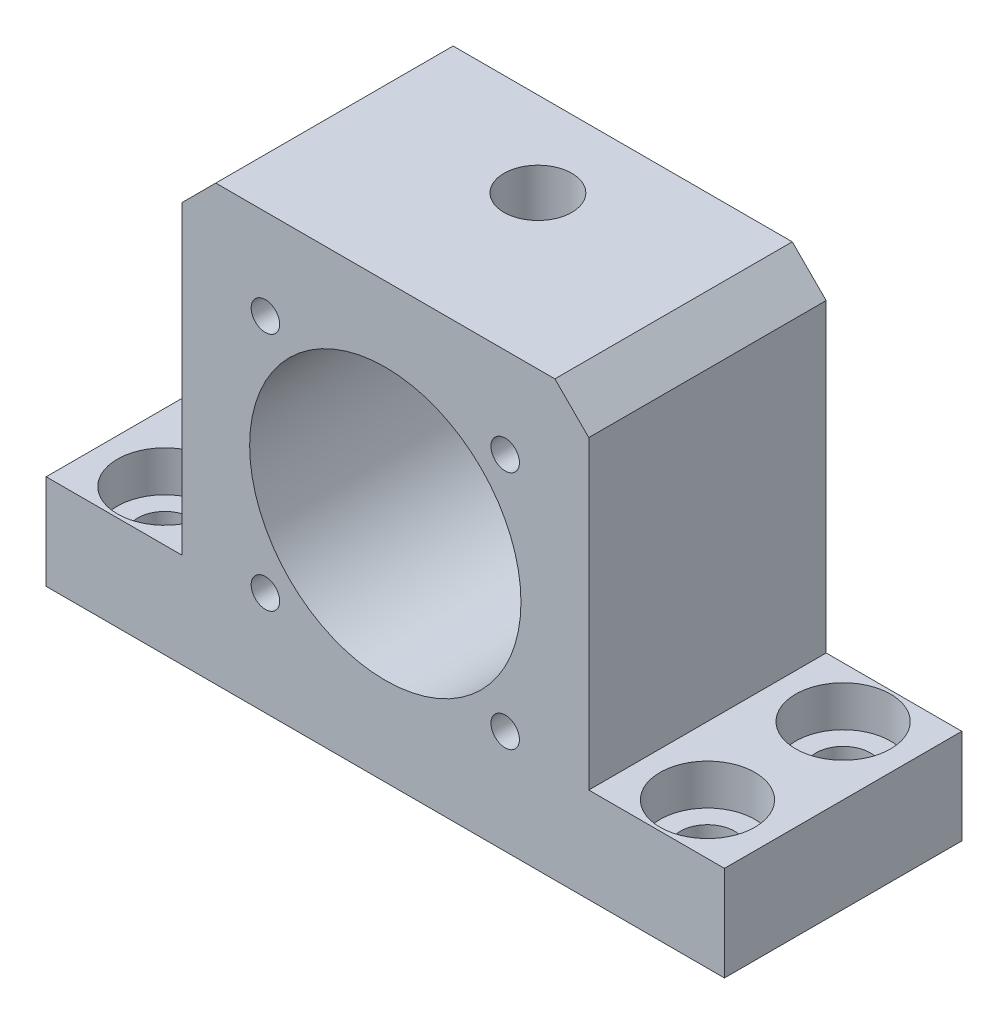
ISO-10303-21;
HEADER;
FILE_DESCRIPTION(('STEP AP214'),'2;1');
FILE_NAME('part.step','',(''),(''),'','','');
FILE_SCHEMA(('AUTOMOTIVE_DESIGN { 1 0 10303 214 1 1 1 1 }'));
ENDSEC;
DATA;
#1=APPLICATION_CONTEXT('core data for automotive mechanical design processes');
#2=APPLICATION_PROTOCOL_DEFINITION('international standard','automotive_design',2000,#1);
#3=PRODUCT_CONTEXT('',#1,'mechanical');
#4=PRODUCT('Part','Part','',(#3));
#5=PRODUCT_RELATED_PRODUCT_CATEGORY('part','',(#4));
#6=PRODUCT_DEFINITION_FORMATION('','',#4);
#7=PRODUCT_DEFINITION_CONTEXT('part definition',#1,'design');
#8=PRODUCT_DEFINITION('design','',#6,#7);
#9=PRODUCT_DEFINITION_SHAPE('','',#8);
#10=(LENGTH_UNIT() NAMED_UNIT(*) SI_UNIT(.MILLI.,.METRE.));
#11=(NAMED_UNIT(*) PLANE_ANGLE_UNIT() SI_UNIT($,.RADIAN.));
#12=(NAMED_UNIT(*) SI_UNIT($,.STERADIAN.) SOLID_ANGLE_UNIT());
#13=UNCERTAINTY_MEASURE_WITH_UNIT(LENGTH_MEASURE(1.E-05),#10,'distance_accuracy_value','');
#14=(GEOMETRIC_REPRESENTATION_CONTEXT(3) GLOBAL_UNCERTAINTY_ASSIGNED_CONTEXT((#13)) GLOBAL_UNIT_ASSIGNED_CONTEXT((#10,
#11,#12)) REPRESENTATION_CONTEXT('',''));
#15=CARTESIAN_POINT('',(0.,0.,0.));
#16=DIRECTION('',(0.,0.,1.));
#17=DIRECTION('',(1.,0.,0.));
#18=AXIS2_PLACEMENT_3D('',#15,#16,#17);
#19=CARTESIAN_POINT('',(-50.,14.,17.5));
#20=DIRECTION('',(0.,0.,-1.));
#21=DIRECTION('',(-1.,0.,0.));
#22=AXIS2_PLACEMENT_3D('',#19,#20,#21);
#23=PLANE('',#22);
#24=CARTESIAN_POINT('',(-17.6776695296636,15.3223304703362,17.5));
#25=DIRECTION('',(0.,0.,1.));
#26=DIRECTION('',(1.,0.,0.));
#27=AXIS2_PLACEMENT_3D('',#24,#25,#26);
#28=CIRCLE('',#27,2.1);
#29=CARTESIAN_POINT('',(-15.5776695296636,15.3223304703362,17.5));
#30=VERTEX_POINT('',#29);
#31=EDGE_CURVE('E289',#30,#30,#28,.T.);
#32=ORIENTED_EDGE('',*,*,#31,.F.);
#33=EDGE_LOOP('',(#32));
#34=FACE_BOUND('',#33,.T.);
#35=CARTESIAN_POINT('',(17.6776695296638,15.3223304703366,17.5));
#36=DIRECTION('',(0.,0.,1.));
#37=DIRECTION('',(1.,0.,0.));
#38=AXIS2_PLACEMENT_3D('',#35,#36,#37);
#39=CIRCLE('',#38,2.1);
#40=CARTESIAN_POINT('',(19.7776695296638,15.3223304703366,17.5));
#41=VERTEX_POINT('',#40);
#42=EDGE_CURVE('E283',#41,#41,#39,.T.);
#43=ORIENTED_EDGE('',*,*,#42,.F.);
#44=EDGE_LOOP('',(#43));
#45=FACE_BOUND('',#44,.T.);
#46=CARTESIAN_POINT('',(17.6776695296635,50.6776695296638,17.5));
#47=DIRECTION('',(0.,0.,1.));
#48=DIRECTION('',(1.,0.,0.));
#49=AXIS2_PLACEMENT_3D('',#46,#47,#48);
#50=CIRCLE('',#49,2.1);
#51=CARTESIAN_POINT('',(19.7776695296635,50.6776695296638,17.5));
#52=VERTEX_POINT('',#51);
#53=EDGE_CURVE('E277',#52,#52,#50,.T.);
#54=ORIENTED_EDGE('',*,*,#53,.F.);
#55=EDGE_LOOP('',(#54));
#56=FACE_BOUND('',#55,.T.);
#57=CARTESIAN_POINT('',(-17.6776695296639,50.6776695296636,17.5));
#58=DIRECTION('',(0.,0.,1.));
#59=DIRECTION('',(1.,0.,0.));
#60=AXIS2_PLACEMENT_3D('',#57,#58,#59);
#61=CIRCLE('',#60,2.1);
#62=CARTESIAN_POINT('',(-15.5776695296639,50.6776695296636,17.5));
#63=VERTEX_POINT('',#62);
#64=EDGE_CURVE('E271',#63,#63,#61,.T.);
#65=ORIENTED_EDGE('',*,*,#64,.F.);
#66=EDGE_LOOP('',(#65));
#67=FACE_BOUND('',#66,.T.);
#68=DIRECTION('',(0.,-1.,0.));
#69=VECTOR('',#68,1.);
#70=CARTESIAN_POINT('',(-50.,0.,17.5));
#71=LINE('',#70,#69);
#72=CARTESIAN_POINT('',(-50.,14.,17.5));
#73=VERTEX_POINT('',#72);
#74=CARTESIAN_POINT('',(-50.,0.,17.5));
#75=VERTEX_POINT('',#74);
#76=EDGE_CURVE('E167',#73,#75,#71,.T.);
#77=ORIENTED_EDGE('',*,*,#76,.T.);
#78=DIRECTION('',(1.,0.,0.));
#79=VECTOR('',#78,1.);
#80=CARTESIAN_POINT('',(-50.,0.,17.5));
#81=LINE('',#80,#79);
#82=CARTESIAN_POINT('',(50.,0.,17.5));
#83=VERTEX_POINT('',#82);
#84=EDGE_CURVE('E103',#75,#83,#81,.T.);
#85=ORIENTED_EDGE('',*,*,#84,.T.);
#86=DIRECTION('',(0.,1.,0.));
#87=VECTOR('',#86,1.);
#88=CARTESIAN_POINT('',(50.,0.,17.5));
#89=LINE('',#88,#87);
#90=CARTESIAN_POINT('',(50.,14.,17.5));
#91=VERTEX_POINT('',#90);
#92=EDGE_CURVE('E188',#83,#91,#89,.T.);
#93=ORIENTED_EDGE('',*,*,#92,.T.);
#94=DIRECTION('',(-1.,0.,0.));
#95=VECTOR('',#94,1.);
#96=CARTESIAN_POINT('',(30.,14.,17.5));
#97=LINE('',#96,#95);
#98=CARTESIAN_POINT('',(30.,14.,17.5));
#99=VERTEX_POINT('',#98);
#100=EDGE_CURVE('E207',#91,#99,#97,.T.);
#101=ORIENTED_EDGE('',*,*,#100,.T.);
#102=DIRECTION('',(0.,1.,0.));
#103=VECTOR('',#102,1.);
#104=CARTESIAN_POINT('',(30.,14.,17.5));
#105=LINE('',#104,#103);
#106=CARTESIAN_POINT('',(30.,59.,17.5));
#107=VERTEX_POINT('',#106);
#108=EDGE_CURVE('E204',#99,#107,#105,.T.);
#109=ORIENTED_EDGE('',*,*,#108,.T.);
#110=DIRECTION('',(-0.707106781186548,0.707106781186547,0.));
#111=VECTOR('',#110,1.);
#112=CARTESIAN_POINT('',(25.,64.,17.5));
#113=LINE('',#112,#111);
#114=CARTESIAN_POINT('',(25.,64.,17.5));
#115=VERTEX_POINT('',#114);
#116=EDGE_CURVE('E206',#107,#115,#113,.T.);
#117=ORIENTED_EDGE('',*,*,#116,.T.);
#118=DIRECTION('',(-1.,0.,0.));
#119=VECTOR('',#118,1.);
#120=CARTESIAN_POINT('',(-25.,64.,17.5));
#121=LINE('',#120,#119);
#122=CARTESIAN_POINT('',(-25.,64.,17.5));
#123=VERTEX_POINT('',#122);
#124=EDGE_CURVE('E130',#115,#123,#121,.T.);
#125=ORIENTED_EDGE('',*,*,#124,.T.);
#126=DIRECTION('',(-0.707106781186548,-0.707106781186547,0.));
#127=VECTOR('',#126,1.);
#128=CARTESIAN_POINT('',(-30.,59.,17.5));
#129=LINE('',#128,#127);
#130=CARTESIAN_POINT('',(-30.,59.,17.5));
#131=VERTEX_POINT('',#130);
#132=EDGE_CURVE('E124',#123,#131,#129,.T.);
#133=ORIENTED_EDGE('',*,*,#132,.T.);
#134=DIRECTION('',(0.,-1.,0.));
#135=VECTOR('',#134,1.);
#136=CARTESIAN_POINT('',(-30.,14.,17.5));
#137=LINE('',#136,#135);
#138=CARTESIAN_POINT('',(-30.,14.,17.5));
#139=VERTEX_POINT('',#138);
#140=EDGE_CURVE('E128',#131,#139,#137,.T.);
#141=ORIENTED_EDGE('',*,*,#140,.T.);
#142=DIRECTION('',(-1.,0.,0.));
#143=VECTOR('',#142,1.);
#144=CARTESIAN_POINT('',(-50.,14.,17.5));
#145=LINE('',#144,#143);
#146=EDGE_CURVE('E53',#139,#73,#145,.T.);
#147=ORIENTED_EDGE('',*,*,#146,.T.);
#148=EDGE_LOOP('',(#77,#85,#93,#101,#109,#117,#125,#133,#141,#147));
#149=FACE_BOUND('',#148,.T.);
#150=CARTESIAN_POINT('',(0.,33.,17.5));
#151=DIRECTION('',(0.,0.,1.));
#152=DIRECTION('',(1.,0.,0.));
#153=AXIS2_PLACEMENT_3D('',#150,#151,#152);
#154=CIRCLE('',#153,20.);
#155=CARTESIAN_POINT('',(20.,33.,17.5));
#156=VERTEX_POINT('',#155);
#157=EDGE_CURVE('E152',#156,#156,#154,.T.);
#158=ORIENTED_EDGE('',*,*,#157,.F.);
#159=EDGE_LOOP('',(#158));
#160=FACE_BOUND('',#159,.T.);
#161=ADVANCED_FACE('F36',(#34,#45,#56,#67,#149,#160),#23,.F.);
#162=CARTESIAN_POINT('',(-50.,14.,-17.5));
#163=DIRECTION('',(0.,0.,-1.));
#164=DIRECTION('',(-1.,0.,0.));
#165=AXIS2_PLACEMENT_3D('',#162,#163,#164);
#166=PLANE('',#165);
#167=DIRECTION('',(0.,-1.,0.));
#168=VECTOR('',#167,1.);
#169=CARTESIAN_POINT('',(-50.,0.,-17.5));
#170=LINE('',#169,#168);
#171=CARTESIAN_POINT('',(-50.,14.,-17.5));
#172=VERTEX_POINT('',#171);
#173=CARTESIAN_POINT('',(-50.,0.,-17.5));
#174=VERTEX_POINT('',#173);
#175=EDGE_CURVE('E148',#172,#174,#170,.T.);
#176=ORIENTED_EDGE('',*,*,#175,.F.);
#177=DIRECTION('',(-1.,0.,0.));
#178=VECTOR('',#177,1.);
#179=CARTESIAN_POINT('',(-50.,14.,-17.5));
#180=LINE('',#179,#178);
#181=CARTESIAN_POINT('',(-30.,14.,-17.5));
#182=VERTEX_POINT('',#181);
#183=EDGE_CURVE('E95',#182,#172,#180,.T.);
#184=ORIENTED_EDGE('',*,*,#183,.F.);
#185=DIRECTION('',(0.,-1.,0.));
#186=VECTOR('',#185,1.);
#187=CARTESIAN_POINT('',(-30.,14.,-17.5));
#188=LINE('',#187,#186);
#189=CARTESIAN_POINT('',(-30.,59.,-17.5));
#190=VERTEX_POINT('',#189);
#191=EDGE_CURVE('E89',#190,#182,#188,.T.);
#192=ORIENTED_EDGE('',*,*,#191,.F.);
#193=DIRECTION('',(-0.707106781186548,-0.707106781186547,0.));
#194=VECTOR('',#193,1.);
#195=CARTESIAN_POINT('',(-30.,59.,-17.5));
#196=LINE('',#195,#194);
#197=CARTESIAN_POINT('',(-25.,64.,-17.5));
#198=VERTEX_POINT('',#197);
#199=EDGE_CURVE('E138',#198,#190,#196,.T.);
#200=ORIENTED_EDGE('',*,*,#199,.F.);
#201=DIRECTION('',(-1.,0.,0.));
#202=VECTOR('',#201,1.);
#203=CARTESIAN_POINT('',(-25.,64.,-17.5));
#204=LINE('',#203,#202);
#205=CARTESIAN_POINT('',(25.,64.,-17.5));
#206=VERTEX_POINT('',#205);
#207=EDGE_CURVE('E162',#206,#198,#204,.T.);
#208=ORIENTED_EDGE('',*,*,#207,.F.);
#209=DIRECTION('',(-0.707106781186548,0.707106781186547,0.));
#210=VECTOR('',#209,1.);
#211=CARTESIAN_POINT('',(25.,64.,-17.5));
#212=LINE('',#211,#210);
#213=CARTESIAN_POINT('',(30.,59.,-17.5));
#214=VERTEX_POINT('',#213);
#215=EDGE_CURVE('E160',#214,#206,#212,.T.);
#216=ORIENTED_EDGE('',*,*,#215,.F.);
#217=DIRECTION('',(0.,1.,0.));
#218=VECTOR('',#217,1.);
#219=CARTESIAN_POINT('',(30.,14.,-17.5));
#220=LINE('',#219,#218);
#221=CARTESIAN_POINT('',(30.,14.,-17.5));
#222=VERTEX_POINT('',#221);
#223=EDGE_CURVE('E158',#222,#214,#220,.T.);
#224=ORIENTED_EDGE('',*,*,#223,.F.);
#225=DIRECTION('',(-1.,0.,0.));
#226=VECTOR('',#225,1.);
#227=CARTESIAN_POINT('',(30.,14.,-17.5));
#228=LINE('',#227,#226);
#229=CARTESIAN_POINT('',(50.,14.,-17.5));
#230=VERTEX_POINT('',#229);
#231=EDGE_CURVE('E156',#230,#222,#228,.T.);
#232=ORIENTED_EDGE('',*,*,#231,.F.);
#233=DIRECTION('',(0.,1.,0.));
#234=VECTOR('',#233,1.);
#235=CARTESIAN_POINT('',(50.,0.,-17.5));
#236=LINE('',#235,#234);
#237=CARTESIAN_POINT('',(50.,0.,-17.5));
#238=VERTEX_POINT('',#237);
#239=EDGE_CURVE('E154',#238,#230,#236,.T.);
#240=ORIENTED_EDGE('',*,*,#239,.F.);
#241=DIRECTION('',(1.,0.,0.));
#242=VECTOR('',#241,1.);
#243=CARTESIAN_POINT('',(-50.,0.,-17.5));
#244=LINE('',#243,#242);
#245=EDGE_CURVE('E151',#174,#238,#244,.T.);
#246=ORIENTED_EDGE('',*,*,#245,.F.);
#247=EDGE_LOOP('',(#176,#184,#192,#200,#208,#216,#224,#232,#240,#246));
#248=FACE_BOUND('',#247,.T.);
#249=CARTESIAN_POINT('',(0.,33.,-17.5));
#250=DIRECTION('',(0.,0.,1.));
#251=DIRECTION('',(1.,0.,0.));
#252=AXIS2_PLACEMENT_3D('',#249,#250,#251);
#253=CIRCLE('',#252,20.);
#254=CARTESIAN_POINT('',(20.,33.,-17.5));
#255=VERTEX_POINT('',#254);
#256=EDGE_CURVE('E215',#255,#255,#253,.T.);
#257=ORIENTED_EDGE('',*,*,#256,.T.);
#258=EDGE_LOOP('',(#257));
#259=FACE_BOUND('',#258,.T.);
#260=ADVANCED_FACE('F192',(#248,#259),#166,.T.);
#261=CARTESIAN_POINT('',(-50.,0.,17.5));
#262=DIRECTION('',(1.,0.,0.));
#263=DIRECTION('',(0.,0.,-1.));
#264=AXIS2_PLACEMENT_3D('',#261,#262,#263);
#265=PLANE('',#264);
#266=ORIENTED_EDGE('',*,*,#175,.T.);
#267=DIRECTION('',(0.,0.,-1.));
#268=VECTOR('',#267,1.);
#269=CARTESIAN_POINT('',(-50.,0.,17.5));
#270=LINE('',#269,#268);
#271=EDGE_CURVE('E11',#75,#174,#270,.T.);
#272=ORIENTED_EDGE('',*,*,#271,.F.);
#273=ORIENTED_EDGE('',*,*,#76,.F.);
#274=DIRECTION('',(0.,0.,-1.));
#275=VECTOR('',#274,1.);
#276=CARTESIAN_POINT('',(-50.,14.,17.5));
#277=LINE('',#276,#275);
#278=EDGE_CURVE('E144',#73,#172,#277,.T.);
#279=ORIENTED_EDGE('',*,*,#278,.T.);
#280=EDGE_LOOP('',(#266,#272,#273,#279));
#281=FACE_BOUND('',#280,.T.);
#282=ADVANCED_FACE('F38',(#281),#265,.F.);
#283=CARTESIAN_POINT('',(-50.,0.,17.5));
#284=DIRECTION('',(0.,1.,0.));
#285=DIRECTION('',(-1.,0.,0.));
#286=AXIS2_PLACEMENT_3D('',#283,#284,#285);
#287=PLANE('',#286);
#288=CARTESIAN_POINT('',(-40.,0.,10.));
#289=DIRECTION('',(0.,1.,0.));
#290=DIRECTION('',(0.,0.,1.));
#291=AXIS2_PLACEMENT_3D('',#288,#289,#290);
#292=CIRCLE('',#291,4.00000000000001);
#293=CARTESIAN_POINT('',(-40.,0.,14.));
#294=VERTEX_POINT('',#293);
#295=EDGE_CURVE('E256',#294,#294,#292,.T.);
#296=ORIENTED_EDGE('',*,*,#295,.T.);
#297=EDGE_LOOP('',(#296));
#298=FACE_BOUND('',#297,.T.);
#299=CARTESIAN_POINT('',(-40.,0.,-10.));
#300=DIRECTION('',(0.,1.,0.));
#301=DIRECTION('',(0.,0.,1.));
#302=AXIS2_PLACEMENT_3D('',#299,#300,#301);
#303=CIRCLE('',#302,4.00000000000001);
#304=CARTESIAN_POINT('',(-40.,0.,-5.99999999999999));
#305=VERTEX_POINT('',#304);
#306=EDGE_CURVE('E244',#305,#305,#303,.T.);
#307=ORIENTED_EDGE('',*,*,#306,.T.);
#308=EDGE_LOOP('',(#307));
#309=FACE_BOUND('',#308,.T.);
#310=CARTESIAN_POINT('',(40.,0.,-10.));
#311=DIRECTION('',(0.,1.,0.));
#312=DIRECTION('',(0.,0.,1.));
#313=AXIS2_PLACEMENT_3D('',#310,#311,#312);
#314=CIRCLE('',#313,4.00000000000001);
#315=CARTESIAN_POINT('',(40.,0.,-5.99999999999999));
#316=VERTEX_POINT('',#315);
#317=EDGE_CURVE('E232',#316,#316,#314,.T.);
#318=ORIENTED_EDGE('',*,*,#317,.T.);
#319=EDGE_LOOP('',(#318));
#320=FACE_BOUND('',#319,.T.);
#321=CARTESIAN_POINT('',(40.,0.,10.));
#322=DIRECTION('',(0.,1.,0.));
#323=DIRECTION('',(0.,0.,1.));
#324=AXIS2_PLACEMENT_3D('',#321,#322,#323);
#325=CIRCLE('',#324,4.00000000000001);
#326=CARTESIAN_POINT('',(40.,0.,14.));
#327=VERTEX_POINT('',#326);
#328=EDGE_CURVE('E218',#327,#327,#325,.T.);
#329=ORIENTED_EDGE('',*,*,#328,.T.);
#330=EDGE_LOOP('',(#329));
#331=FACE_BOUND('',#330,.T.);
#332=ORIENTED_EDGE('',*,*,#245,.T.);
#333=DIRECTION('',(0.,0.,-1.));
#334=VECTOR('',#333,1.);
#335=CARTESIAN_POINT('',(50.,0.,17.5));
#336=LINE('',#335,#334);
#337=EDGE_CURVE('E45',#83,#238,#336,.T.);
#338=ORIENTED_EDGE('',*,*,#337,.F.);
#339=ORIENTED_EDGE('',*,*,#84,.F.);
#340=ORIENTED_EDGE('',*,*,#271,.T.);
#341=EDGE_LOOP('',(#332,#338,#339,#340));
#342=FACE_BOUND('',#341,.T.);
#343=ADVANCED_FACE('F418',(#298,#309,#320,#331,#342),#287,.F.);
#344=CARTESIAN_POINT('',(50.,0.,17.5));
#345=DIRECTION('',(-1.,0.,0.));
#346=DIRECTION('',(0.,0.,1.));
#347=AXIS2_PLACEMENT_3D('',#344,#345,#346);
#348=PLANE('',#347);
#349=ORIENTED_EDGE('',*,*,#239,.T.);
#350=DIRECTION('',(0.,0.,-1.));
#351=VECTOR('',#350,1.);
#352=CARTESIAN_POINT('',(50.,14.,17.5));
#353=LINE('',#352,#351);
#354=EDGE_CURVE('E180',#91,#230,#353,.T.);
#355=ORIENTED_EDGE('',*,*,#354,.F.);
#356=ORIENTED_EDGE('',*,*,#92,.F.);
#357=ORIENTED_EDGE('',*,*,#337,.T.);
#358=EDGE_LOOP('',(#349,#355,#356,#357));
#359=FACE_BOUND('',#358,.T.);
#360=ADVANCED_FACE('F186',(#359),#348,.F.);
#361=CARTESIAN_POINT('',(30.,14.,17.5));
#362=DIRECTION('',(0.,-1.,0.));
#363=DIRECTION('',(1.,0.,0.));
#364=AXIS2_PLACEMENT_3D('',#361,#362,#363);
#365=PLANE('',#364);
#366=CARTESIAN_POINT('',(40.,14.,-10.));
#367=DIRECTION('',(0.,1.,0.));
#368=DIRECTION('',(0.,0.,1.));
#369=AXIS2_PLACEMENT_3D('',#366,#367,#368);
#370=CIRCLE('',#369,7.);
#371=CARTESIAN_POINT('',(40.,14.,-3.));
#372=VERTEX_POINT('',#371);
#373=EDGE_CURVE('E241',#372,#372,#370,.T.);
#374=ORIENTED_EDGE('',*,*,#373,.F.);
#375=EDGE_LOOP('',(#374));
#376=FACE_BOUND('',#375,.T.);
#377=CARTESIAN_POINT('',(40.,14.,10.));
#378=DIRECTION('',(0.,1.,0.));
#379=DIRECTION('',(0.,0.,1.));
#380=AXIS2_PLACEMENT_3D('',#377,#378,#379);
#381=CIRCLE('',#380,7.);
#382=CARTESIAN_POINT('',(40.,14.,17.));
#383=VERTEX_POINT('',#382);
#384=EDGE_CURVE('E229',#383,#383,#381,.T.);
#385=ORIENTED_EDGE('',*,*,#384,.F.);
#386=EDGE_LOOP('',(#385));
#387=FACE_BOUND('',#386,.T.);
#388=ORIENTED_EDGE('',*,*,#231,.T.);
#389=DIRECTION('',(0.,0.,-1.));
#390=VECTOR('',#389,1.);
#391=CARTESIAN_POINT('',(30.,14.,17.5));
#392=LINE('',#391,#390);
#393=EDGE_CURVE('E177',#99,#222,#392,.T.);
#394=ORIENTED_EDGE('',*,*,#393,.F.);
#395=ORIENTED_EDGE('',*,*,#100,.F.);
#396=ORIENTED_EDGE('',*,*,#354,.T.);
#397=EDGE_LOOP('',(#388,#394,#395,#396));
#398=FACE_BOUND('',#397,.T.);
#399=ADVANCED_FACE('F198',(#376,#387,#398),#365,.F.);
#400=CARTESIAN_POINT('',(30.,14.,17.5));
#401=DIRECTION('',(-1.,0.,0.));
#402=DIRECTION('',(0.,-1.,0.));
#403=AXIS2_PLACEMENT_3D('',#400,#401,#402);
#404=PLANE('',#403);
#405=ORIENTED_EDGE('',*,*,#223,.T.);
#406=DIRECTION('',(0.,0.,-1.));
#407=VECTOR('',#406,1.);
#408=CARTESIAN_POINT('',(30.,59.,17.5));
#409=LINE('',#408,#407);
#410=EDGE_CURVE('E174',#107,#214,#409,.T.);
#411=ORIENTED_EDGE('',*,*,#410,.F.);
#412=ORIENTED_EDGE('',*,*,#108,.F.);
#413=ORIENTED_EDGE('',*,*,#393,.T.);
#414=EDGE_LOOP('',(#405,#411,#412,#413));
#415=FACE_BOUND('',#414,.T.);
#416=ADVANCED_FACE('F202',(#415),#404,.F.);
#417=CARTESIAN_POINT('',(25.,64.,17.5));
#418=DIRECTION('',(-0.707106781186547,-0.707106781186548,0.));
#419=DIRECTION('',(0.707106781186548,-0.707106781186547,0.));
#420=AXIS2_PLACEMENT_3D('',#417,#418,#419);
#421=PLANE('',#420);
#422=ORIENTED_EDGE('',*,*,#215,.T.);
#423=DIRECTION('',(0.,0.,-1.));
#424=VECTOR('',#423,1.);
#425=CARTESIAN_POINT('',(25.,64.,17.5));
#426=LINE('',#425,#424);
#427=EDGE_CURVE('E171',#115,#206,#426,.T.);
#428=ORIENTED_EDGE('',*,*,#427,.F.);
#429=ORIENTED_EDGE('',*,*,#116,.F.);
#430=ORIENTED_EDGE('',*,*,#410,.T.);
#431=EDGE_LOOP('',(#422,#428,#429,#430));
#432=FACE_BOUND('',#431,.T.);
#433=ADVANCED_FACE('F407',(#432),#421,.F.);
#434=CARTESIAN_POINT('',(-25.,64.,17.5));
#435=DIRECTION('',(0.,-1.,0.));
#436=DIRECTION('',(0.,0.,-1.));
#437=AXIS2_PLACEMENT_3D('',#434,#435,#436);
#438=PLANE('',#437);
#439=CARTESIAN_POINT('',(0.,64.,-5.));
#440=DIRECTION('',(0.,1.,0.));
#441=DIRECTION('',(0.,0.,1.));
#442=AXIS2_PLACEMENT_3D('',#439,#440,#441);
#443=CIRCLE('',#442,5.);
#444=CARTESIAN_POINT('',(0.,64.,0.));
#445=VERTEX_POINT('',#444);
#446=EDGE_CURVE('E292',#445,#445,#443,.T.);
#447=ORIENTED_EDGE('',*,*,#446,.F.);
#448=EDGE_LOOP('',(#447));
#449=FACE_BOUND('',#448,.T.);
#450=ORIENTED_EDGE('',*,*,#207,.T.);
#451=DIRECTION('',(0.,0.,-1.));
#452=VECTOR('',#451,1.);
#453=CARTESIAN_POINT('',(-25.,64.,17.5));
#454=LINE('',#453,#452);
#455=EDGE_CURVE('E139',#123,#198,#454,.T.);
#456=ORIENTED_EDGE('',*,*,#455,.F.);
#457=ORIENTED_EDGE('',*,*,#124,.F.);
#458=ORIENTED_EDGE('',*,*,#427,.T.);
#459=EDGE_LOOP('',(#450,#456,#457,#458));
#460=FACE_BOUND('',#459,.T.);
#461=ADVANCED_FACE('F404',(#449,#460),#438,.F.);
#462=CARTESIAN_POINT('',(-30.,59.,17.5));
#463=DIRECTION('',(0.707106781186547,-0.707106781186548,0.));
#464=DIRECTION('',(0.707106781186548,0.707106781186547,0.));
#465=AXIS2_PLACEMENT_3D('',#462,#463,#464);
#466=PLANE('',#465);
#467=ORIENTED_EDGE('',*,*,#199,.T.);
#468=DIRECTION('',(0.,0.,-1.));
#469=VECTOR('',#468,1.);
#470=CARTESIAN_POINT('',(-30.,59.,17.5));
#471=LINE('',#470,#469);
#472=EDGE_CURVE('E135',#131,#190,#471,.T.);
#473=ORIENTED_EDGE('',*,*,#472,.F.);
#474=ORIENTED_EDGE('',*,*,#132,.F.);
#475=ORIENTED_EDGE('',*,*,#455,.T.);
#476=EDGE_LOOP('',(#467,#473,#474,#475));
#477=FACE_BOUND('',#476,.T.);
#478=ADVANCED_FACE('F136',(#477),#466,.F.);
#479=CARTESIAN_POINT('',(-30.,14.,17.5));
#480=DIRECTION('',(1.,0.,0.));
#481=DIRECTION('',(0.,0.,-1.));
#482=AXIS2_PLACEMENT_3D('',#479,#480,#481);
#483=PLANE('',#482);
#484=ORIENTED_EDGE('',*,*,#191,.T.);
#485=DIRECTION('',(0.,0.,-1.));
#486=VECTOR('',#485,1.);
#487=CARTESIAN_POINT('',(-30.,14.,17.5));
#488=LINE('',#487,#486);
#489=EDGE_CURVE('E140',#139,#182,#488,.T.);
#490=ORIENTED_EDGE('',*,*,#489,.F.);
#491=ORIENTED_EDGE('',*,*,#140,.F.);
#492=ORIENTED_EDGE('',*,*,#472,.T.);
#493=EDGE_LOOP('',(#484,#490,#491,#492));
#494=FACE_BOUND('',#493,.T.);
#495=ADVANCED_FACE('F142',(#494),#483,.F.);
#496=CARTESIAN_POINT('',(-50.,14.,17.5));
#497=DIRECTION('',(0.,-1.,0.));
#498=DIRECTION('',(0.,0.,-1.));
#499=AXIS2_PLACEMENT_3D('',#496,#497,#498);
#500=PLANE('',#499);
#501=CARTESIAN_POINT('',(-40.,14.,10.));
#502=DIRECTION('',(0.,1.,0.));
#503=DIRECTION('',(0.,0.,1.));
#504=AXIS2_PLACEMENT_3D('',#501,#502,#503);
#505=CIRCLE('',#504,7.);
#506=CARTESIAN_POINT('',(-40.,14.,17.));
#507=VERTEX_POINT('',#506);
#508=EDGE_CURVE('E265',#507,#507,#505,.T.);
#509=ORIENTED_EDGE('',*,*,#508,.F.);
#510=EDGE_LOOP('',(#509));
#511=FACE_BOUND('',#510,.T.);
#512=CARTESIAN_POINT('',(-40.,14.,-10.));
#513=DIRECTION('',(0.,1.,0.));
#514=DIRECTION('',(0.,0.,1.));
#515=AXIS2_PLACEMENT_3D('',#512,#513,#514);
#516=CIRCLE('',#515,7.);
#517=CARTESIAN_POINT('',(-40.,14.,-3.));
#518=VERTEX_POINT('',#517);
#519=EDGE_CURVE('E253',#518,#518,#516,.T.);
#520=ORIENTED_EDGE('',*,*,#519,.F.);
#521=EDGE_LOOP('',(#520));
#522=FACE_BOUND('',#521,.T.);
#523=ORIENTED_EDGE('',*,*,#183,.T.);
#524=ORIENTED_EDGE('',*,*,#278,.F.);
#525=ORIENTED_EDGE('',*,*,#146,.F.);
#526=ORIENTED_EDGE('',*,*,#489,.T.);
#527=EDGE_LOOP('',(#523,#524,#525,#526));
#528=FACE_BOUND('',#527,.T.);
#529=ADVANCED_FACE('F390',(#511,#522,#528),#500,.F.);
#530=CARTESIAN_POINT('',(0.,33.,17.5));
#531=DIRECTION('',(0.,0.,-1.));
#532=DIRECTION('',(-1.,0.,0.));
#533=AXIS2_PLACEMENT_3D('',#530,#531,#532);
#534=CYLINDRICAL_SURFACE('',#533,20.);
#535=CARTESIAN_POINT('',(0.,53.,0.));
#536=CARTESIAN_POINT('',(0.276253628899103,52.9999953289338,-7.75246052686772E-06));
#537=CARTESIAN_POINT('',(0.552593859435877,52.9942192710609,-0.0229718359126231));
#538=CARTESIAN_POINT('',(1.09735441256844,52.9717371276631,-0.114083837690015));
#539=CARTESIAN_POINT('',(1.3657701562358,52.9550248473325,-0.182257365126166));
#540=CARTESIAN_POINT('',(1.88673624060859,52.9125208777344,-0.36146417820695));
#541=CARTESIAN_POINT('',(2.13930521143334,52.8867400947353,-0.472445995717562));
#542=CARTESIAN_POINT('',(2.62224043968143,52.8288447935874,-0.733937966816138));
#543=CARTESIAN_POINT('',(2.85260594782921,52.7967300618052,-0.884449453729889));
#544=CARTESIAN_POINT('',(3.28933975766972,52.7289137863898,-1.2240026321806));
#545=CARTESIAN_POINT('',(3.49518563353686,52.6931569049376,-1.41370524986353));
#546=CARTESIAN_POINT('',(3.87249642401107,52.6224540039312,-1.82484068303011));
#547=CARTESIAN_POINT('',(4.04395745649731,52.5875080763289,-2.04627707648979));
#548=CARTESIAN_POINT('',(4.35008847599658,52.5218258566056,-2.51865075578997));
#549=CARTESIAN_POINT('',(4.4841740530838,52.4911598154937,-2.76997743602909));
#550=CARTESIAN_POINT('',(4.70798969516915,52.4383164939339,-3.29249470553345));
#551=CARTESIAN_POINT('',(4.79772685146714,52.4161378564806,-3.56368211110672));
#552=CARTESIAN_POINT('',(4.92851612268255,52.3833492232108,-4.11247832733886));
#553=CARTESIAN_POINT('',(4.97050756110685,52.372516366567,-4.38984965345997));
#554=CARTESIAN_POINT('',(5.00753925022136,52.3629787486531,-4.94789522999782));
#555=CARTESIAN_POINT('',(5.00258713939371,52.3642720142643,-5.22856893564046));
#556=CARTESIAN_POINT('',(4.94662174879902,52.3786401838939,-5.77805269248451));
#557=CARTESIAN_POINT('',(4.89672780063545,52.3914287669098,-6.04698540488443));
#558=CARTESIAN_POINT('',(4.75408062300998,52.426890322369,-6.5725368363702));
#559=CARTESIAN_POINT('',(4.66132434023131,52.4495639989746,-6.82915467676307));
#560=CARTESIAN_POINT('',(4.43463159312395,52.5025037968553,-7.3257933875071));
#561=CARTESIAN_POINT('',(4.3002888907764,52.5328442489939,-7.5656205726319));
#562=CARTESIAN_POINT('',(3.99452092004982,52.5976570281997,-8.01972903252274));
#563=CARTESIAN_POINT('',(3.82308916269613,52.6321300778209,-8.23400582689084));
#564=CARTESIAN_POINT('',(3.44221141560407,52.7025293513297,-8.63734538564802));
#565=CARTESIAN_POINT('',(3.23182086055287,52.7384689826,-8.82551496687117));
#566=CARTESIAN_POINT('',(2.78203972501233,52.8068655192919,-9.16407080821301));
#567=CARTESIAN_POINT('',(2.54264825902648,52.8393223183136,-9.31445591421189));
#568=CARTESIAN_POINT('',(2.04038629560464,52.897257736473,-9.57350195408129));
#569=CARTESIAN_POINT('',(1.77743797736208,52.9227120042576,-9.6820178008481));
#570=CARTESIAN_POINT('',(1.23625336047628,52.9635972330472,-9.85305768569858));
#571=CARTESIAN_POINT('',(0.958019997168282,52.9790301113094,-9.91559052139379));
#572=CARTESIAN_POINT('',(0.401799901300089,52.9978499757125,-9.99152521852946));
#573=CARTESIAN_POINT('',(0.123989066627366,53.0015351169426,-10.006143420251));
#574=CARTESIAN_POINT('',(-0.430109582671696,52.9972934938151,-9.98916999314838));
#575=CARTESIAN_POINT('',(-0.706397532148654,52.9893677747284,-9.95758252400288));
#576=CARTESIAN_POINT('',(-1.24538089592163,52.9629860375784,-9.85009697202875));
#577=CARTESIAN_POINT('',(-1.50821706322917,52.9446878061929,-9.77486245507676));
#578=CARTESIAN_POINT('',(-2.01752430817505,52.899623554472,-9.5829763865718));
#579=CARTESIAN_POINT('',(-2.26399373010884,52.8728566789995,-9.46632065228927));
#580=CARTESIAN_POINT('',(-2.73841044809943,52.8131102642072,-9.19254623708441));
#581=CARTESIAN_POINT('',(-2.96595147278588,52.7800289122194,-9.03474629201144));
#582=CARTESIAN_POINT('',(-3.39175537881104,52.7114836395924,-8.68403363734279));
#583=CARTESIAN_POINT('',(-3.59001319657751,52.676019308434,-8.49111486794122));
#584=CARTESIAN_POINT('',(-3.95663522690827,52.6056318986475,-8.06999346385427));
#585=CARTESIAN_POINT('',(-4.12414622540362,52.57074347274,-7.84104099000128));
#586=CARTESIAN_POINT('',(-4.41836919671215,52.5064292794107,-7.35755788510492));
#587=CARTESIAN_POINT('',(-4.54508298053823,52.4770032695336,-7.10302839009921));
#588=CARTESIAN_POINT('',(-4.75317140202426,52.4272698238587,-6.57698092531186));
#589=CARTESIAN_POINT('',(-4.83481465547784,52.4069085073876,-6.30557457228981));
#590=CARTESIAN_POINT('',(-4.95115219981057,52.3775581342603,-5.75230120715155));
#591=CARTESIAN_POINT('',(-4.98585675825596,52.3685665905607,-5.47043649660462));
#592=CARTESIAN_POINT('',(-5.00679530111928,52.3631633735661,-4.91292992044032));
#593=CARTESIAN_POINT('',(-4.99439299259115,52.366397756045,-4.63734188285435));
#594=CARTESIAN_POINT('',(-4.92459092769654,52.3842636317314,-4.09232037106101));
#595=CARTESIAN_POINT('',(-4.86719207562106,52.3988948958968,-3.82288677328047));
#596=CARTESIAN_POINT('',(-4.70977106481402,52.4377086899188,-3.29930513646664));
#597=CARTESIAN_POINT('',(-4.61000468226918,52.461833841343,-3.04507564920413));
#598=CARTESIAN_POINT('',(-4.37088304534897,52.5169251906949,-2.5567820576162));
#599=CARTESIAN_POINT('',(-4.23152230011362,52.5478923373231,-2.3227207560423));
#600=CARTESIAN_POINT('',(-3.91289249545747,52.6141878088207,-1.87481790332794));
#601=CARTESIAN_POINT('',(-3.73267720970761,52.6496088277351,-1.66166308858716));
#602=CARTESIAN_POINT('',(-3.33929790396569,52.7202675748663,-1.26817651734828));
#603=CARTESIAN_POINT('',(-3.12612607087046,52.755505257566,-1.08785256629));
#604=CARTESIAN_POINT('',(-2.66822528900866,52.8225885215915,-0.761962304784741));
#605=CARTESIAN_POINT('',(-2.42299474105463,52.8543611121963,-0.617084621094761));
#606=CARTESIAN_POINT('',(-1.91088686503491,52.9101641658366,-0.370841790198204));
#607=CARTESIAN_POINT('',(-1.6440252114558,52.9342001733259,-0.269445464504871));
#608=CARTESIAN_POINT('',(-1.14803417747824,52.9682686521849,-0.128093898901159));
#609=CARTESIAN_POINT('',(-0.921267236360229,52.9800861684231,-0.0801625231552213));
#610=CARTESIAN_POINT('',(-0.463020238454277,52.9959535077316,-0.0161135212601914));
#611=CARTESIAN_POINT('',(-0.231540537475388,53.0000039150298,6.4976843403733E-06));
#612=CARTESIAN_POINT('',(0.,53.,0.));
#613=B_SPLINE_CURVE_WITH_KNOTS('',3,(#535,#536,#537,#538,#539,#540,#541,#542,#543,#544,#545,
#546,#547,#548,#549,#550,#551,#552,#553,#554,#555,#556,#557,#558,#559,#560,#561,#562,#563,#564,
#565,#566,#567,#568,#569,#570,#571,#572,#573,#574,#575,#576,#577,#578,#579,#580,#581,#582,#583,
#584,#585,#586,#587,#588,#589,#590,#591,#592,#593,#594,#595,#596,#597,#598,#599,#600,#601,#602,
#603,#604,#605,#606,#607,#608,#609,#610,#611,#612),.UNSPECIFIED.,.T.,.F.,(4,2,2,2,2,2,2,2,2,2,2,
2,2,2,2,2,2,2,2,2,2,2,2,2,2,2,2,2,2,2,2,2,2,2,2,2,2,2,4),(0.,0.827912374906299,1.65629412587967,
2.48368300762035,3.31109980056443,4.1538145145713,4.9966243193354,5.85195491819356,
6.70714870564561,7.54520983670233,8.38313460386725,9.20074990034463,10.0184234489786,
10.84435092924,11.6704230279828,12.5200500324113,13.3697029853856,14.2222743004145,
15.0746824563988,15.9052769650866,16.7357967038688,17.5540091505786,18.372304244187,
19.2051195856224,20.0380787670447,20.8914836402599,21.7448506250943,22.5930751539527,
23.4411141086095,24.2647926801851,25.0884546987996,25.9072133522467,26.7260856048285,
27.5663192139288,28.4067523259457,29.2624061835847,30.1174454609768,30.8114080983367,
31.5053185350331),.UNSPECIFIED.);
#614=CARTESIAN_POINT('',(0.,53.,0.));
#615=VERTEX_POINT('',#614);
#616=EDGE_CURVE('E293',#615,#615,#613,.T.);
#617=ORIENTED_EDGE('',*,*,#616,.T.);
#618=EDGE_LOOP('',(#617));
#619=FACE_BOUND('',#618,.T.);
#620=ORIENTED_EDGE('',*,*,#157,.T.);
#621=EDGE_LOOP('',(#620));
#622=FACE_BOUND('',#621,.T.);
#623=ORIENTED_EDGE('',*,*,#256,.F.);
#624=EDGE_LOOP('',(#623));
#625=FACE_BOUND('',#624,.T.);
#626=ADVANCED_FACE('F386',(#619,#622,#625),#534,.F.);
#627=CARTESIAN_POINT('',(40.,14.,10.));
#628=DIRECTION('',(0.,1.,0.));
#629=DIRECTION('',(0.,0.,1.));
#630=AXIS2_PLACEMENT_3D('',#627,#628,#629);
#631=CYLINDRICAL_SURFACE('',#630,4.);
#632=ORIENTED_EDGE('',*,*,#328,.F.);
#633=EDGE_LOOP('',(#632));
#634=FACE_BOUND('',#633,.T.);
#635=CARTESIAN_POINT('',(40.,8.00000000000001,10.));
#636=DIRECTION('',(0.,1.,0.));
#637=DIRECTION('',(0.,0.,1.));
#638=AXIS2_PLACEMENT_3D('',#635,#636,#637);
#639=CIRCLE('',#638,4.);
#640=CARTESIAN_POINT('',(40.,8.00000000000001,14.));
#641=VERTEX_POINT('',#640);
#642=EDGE_CURVE('E223',#641,#641,#639,.T.);
#643=ORIENTED_EDGE('',*,*,#642,.T.);
#644=EDGE_LOOP('',(#643));
#645=FACE_BOUND('',#644,.T.);
#646=ADVANCED_FACE('F382',(#634,#645),#631,.F.);
#647=CARTESIAN_POINT('',(44.,8.00000000000001,10.));
#648=DIRECTION('',(0.,-1.,0.));
#649=DIRECTION('',(0.,0.,-1.));
#650=AXIS2_PLACEMENT_3D('',#647,#648,#649);
#651=PLANE('',#650);
#652=ORIENTED_EDGE('',*,*,#642,.F.);
#653=EDGE_LOOP('',(#652));
#654=FACE_BOUND('',#653,.T.);
#655=CARTESIAN_POINT('',(40.,8.00000000000001,10.));
#656=DIRECTION('',(0.,1.,0.));
#657=DIRECTION('',(0.,0.,1.));
#658=AXIS2_PLACEMENT_3D('',#655,#656,#657);
#659=CIRCLE('',#658,7.);
#660=CARTESIAN_POINT('',(40.,8.00000000000001,17.));
#661=VERTEX_POINT('',#660);
#662=EDGE_CURVE('E226',#661,#661,#659,.T.);
#663=ORIENTED_EDGE('',*,*,#662,.T.);
#664=EDGE_LOOP('',(#663));
#665=FACE_BOUND('',#664,.T.);
#666=ADVANCED_FACE('F378',(#654,#665),#651,.F.);
#667=CARTESIAN_POINT('',(40.,14.,10.));
#668=DIRECTION('',(0.,1.,0.));
#669=DIRECTION('',(0.,0.,1.));
#670=AXIS2_PLACEMENT_3D('',#667,#668,#669);
#671=CYLINDRICAL_SURFACE('',#670,7.);
#672=ORIENTED_EDGE('',*,*,#662,.F.);
#673=EDGE_LOOP('',(#672));
#674=FACE_BOUND('',#673,.T.);
#675=ORIENTED_EDGE('',*,*,#384,.T.);
#676=EDGE_LOOP('',(#675));
#677=FACE_BOUND('',#676,.T.);
#678=ADVANCED_FACE('F374',(#674,#677),#671,.F.);
#679=CARTESIAN_POINT('',(40.,14.,-10.));
#680=DIRECTION('',(0.,1.,0.));
#681=DIRECTION('',(0.,0.,1.));
#682=AXIS2_PLACEMENT_3D('',#679,#680,#681);
#683=CYLINDRICAL_SURFACE('',#682,4.);
#684=ORIENTED_EDGE('',*,*,#317,.F.);
#685=EDGE_LOOP('',(#684));
#686=FACE_BOUND('',#685,.T.);
#687=CARTESIAN_POINT('',(40.,8.00000000000001,-10.));
#688=DIRECTION('',(0.,1.,0.));
#689=DIRECTION('',(0.,0.,1.));
#690=AXIS2_PLACEMENT_3D('',#687,#688,#689);
#691=CIRCLE('',#690,4.);
#692=CARTESIAN_POINT('',(40.,8.00000000000001,-6.));
#693=VERTEX_POINT('',#692);
#694=EDGE_CURVE('E235',#693,#693,#691,.T.);
#695=ORIENTED_EDGE('',*,*,#694,.T.);
#696=EDGE_LOOP('',(#695));
#697=FACE_BOUND('',#696,.T.);
#698=ADVANCED_FACE('F370',(#686,#697),#683,.F.);
#699=CARTESIAN_POINT('',(44.,8.00000000000001,-10.));
#700=DIRECTION('',(0.,-1.,0.));
#701=DIRECTION('',(0.,0.,-1.));
#702=AXIS2_PLACEMENT_3D('',#699,#700,#701);
#703=PLANE('',#702);
#704=ORIENTED_EDGE('',*,*,#694,.F.);
#705=EDGE_LOOP('',(#704));
#706=FACE_BOUND('',#705,.T.);
#707=CARTESIAN_POINT('',(40.,8.00000000000001,-10.));
#708=DIRECTION('',(0.,1.,0.));
#709=DIRECTION('',(0.,0.,1.));
#710=AXIS2_PLACEMENT_3D('',#707,#708,#709);
#711=CIRCLE('',#710,7.);
#712=CARTESIAN_POINT('',(40.,8.00000000000001,-3.));
#713=VERTEX_POINT('',#712);
#714=EDGE_CURVE('E238',#713,#713,#711,.T.);
#715=ORIENTED_EDGE('',*,*,#714,.T.);
#716=EDGE_LOOP('',(#715));
#717=FACE_BOUND('',#716,.T.);
#718=ADVANCED_FACE('F366',(#706,#717),#703,.F.);
#719=CARTESIAN_POINT('',(40.,14.,-10.));
#720=DIRECTION('',(0.,1.,0.));
#721=DIRECTION('',(0.,0.,1.));
#722=AXIS2_PLACEMENT_3D('',#719,#720,#721);
#723=CYLINDRICAL_SURFACE('',#722,7.);
#724=ORIENTED_EDGE('',*,*,#714,.F.);
#725=EDGE_LOOP('',(#724));
#726=FACE_BOUND('',#725,.T.);
#727=ORIENTED_EDGE('',*,*,#373,.T.);
#728=EDGE_LOOP('',(#727));
#729=FACE_BOUND('',#728,.T.);
#730=ADVANCED_FACE('F362',(#726,#729),#723,.F.);
#731=CARTESIAN_POINT('',(-40.,14.,-10.));
#732=DIRECTION('',(0.,1.,0.));
#733=DIRECTION('',(0.,0.,1.));
#734=AXIS2_PLACEMENT_3D('',#731,#732,#733);
#735=CYLINDRICAL_SURFACE('',#734,4.);
#736=ORIENTED_EDGE('',*,*,#306,.F.);
#737=EDGE_LOOP('',(#736));
#738=FACE_BOUND('',#737,.T.);
#739=CARTESIAN_POINT('',(-40.,8.,-10.));
#740=DIRECTION('',(0.,1.,0.));
#741=DIRECTION('',(0.,0.,1.));
#742=AXIS2_PLACEMENT_3D('',#739,#740,#741);
#743=CIRCLE('',#742,4.);
#744=CARTESIAN_POINT('',(-40.,8.,-6.));
#745=VERTEX_POINT('',#744);
#746=EDGE_CURVE('E247',#745,#745,#743,.T.);
#747=ORIENTED_EDGE('',*,*,#746,.T.);
#748=EDGE_LOOP('',(#747));
#749=FACE_BOUND('',#748,.T.);
#750=ADVANCED_FACE('F358',(#738,#749),#735,.F.);
#751=CARTESIAN_POINT('',(-36.,8.,-10.));
#752=DIRECTION('',(0.,-1.,0.));
#753=DIRECTION('',(0.,0.,-1.));
#754=AXIS2_PLACEMENT_3D('',#751,#752,#753);
#755=PLANE('',#754);
#756=ORIENTED_EDGE('',*,*,#746,.F.);
#757=EDGE_LOOP('',(#756));
#758=FACE_BOUND('',#757,.T.);
#759=CARTESIAN_POINT('',(-40.,8.,-10.));
#760=DIRECTION('',(0.,1.,0.));
#761=DIRECTION('',(0.,0.,1.));
#762=AXIS2_PLACEMENT_3D('',#759,#760,#761);
#763=CIRCLE('',#762,7.);
#764=CARTESIAN_POINT('',(-40.,8.,-3.));
#765=VERTEX_POINT('',#764);
#766=EDGE_CURVE('E250',#765,#765,#763,.T.);
#767=ORIENTED_EDGE('',*,*,#766,.T.);
#768=EDGE_LOOP('',(#767));
#769=FACE_BOUND('',#768,.T.);
#770=ADVANCED_FACE('F354',(#758,#769),#755,.F.);
#771=CARTESIAN_POINT('',(-40.,14.,-10.));
#772=DIRECTION('',(0.,1.,0.));
#773=DIRECTION('',(0.,0.,1.));
#774=AXIS2_PLACEMENT_3D('',#771,#772,#773);
#775=CYLINDRICAL_SURFACE('',#774,7.);
#776=ORIENTED_EDGE('',*,*,#766,.F.);
#777=EDGE_LOOP('',(#776));
#778=FACE_BOUND('',#777,.T.);
#779=ORIENTED_EDGE('',*,*,#519,.T.);
#780=EDGE_LOOP('',(#779));
#781=FACE_BOUND('',#780,.T.);
#782=ADVANCED_FACE('F350',(#778,#781),#775,.F.);
#783=CARTESIAN_POINT('',(-40.,14.,10.));
#784=DIRECTION('',(0.,1.,0.));
#785=DIRECTION('',(0.,0.,1.));
#786=AXIS2_PLACEMENT_3D('',#783,#784,#785);
#787=CYLINDRICAL_SURFACE('',#786,4.);
#788=ORIENTED_EDGE('',*,*,#295,.F.);
#789=EDGE_LOOP('',(#788));
#790=FACE_BOUND('',#789,.T.);
#791=CARTESIAN_POINT('',(-40.,8.,10.));
#792=DIRECTION('',(0.,1.,0.));
#793=DIRECTION('',(0.,0.,1.));
#794=AXIS2_PLACEMENT_3D('',#791,#792,#793);
#795=CIRCLE('',#794,4.);
#796=CARTESIAN_POINT('',(-40.,8.,14.));
#797=VERTEX_POINT('',#796);
#798=EDGE_CURVE('E259',#797,#797,#795,.T.);
#799=ORIENTED_EDGE('',*,*,#798,.T.);
#800=EDGE_LOOP('',(#799));
#801=FACE_BOUND('',#800,.T.);
#802=ADVANCED_FACE('F346',(#790,#801),#787,.F.);
#803=CARTESIAN_POINT('',(-36.,8.,10.));
#804=DIRECTION('',(0.,-1.,0.));
#805=DIRECTION('',(0.,0.,-1.));
#806=AXIS2_PLACEMENT_3D('',#803,#804,#805);
#807=PLANE('',#806);
#808=ORIENTED_EDGE('',*,*,#798,.F.);
#809=EDGE_LOOP('',(#808));
#810=FACE_BOUND('',#809,.T.);
#811=CARTESIAN_POINT('',(-40.,8.,10.));
#812=DIRECTION('',(0.,1.,0.));
#813=DIRECTION('',(0.,0.,1.));
#814=AXIS2_PLACEMENT_3D('',#811,#812,#813);
#815=CIRCLE('',#814,7.);
#816=CARTESIAN_POINT('',(-40.,8.,17.));
#817=VERTEX_POINT('',#816);
#818=EDGE_CURVE('E262',#817,#817,#815,.T.);
#819=ORIENTED_EDGE('',*,*,#818,.T.);
#820=EDGE_LOOP('',(#819));
#821=FACE_BOUND('',#820,.T.);
#822=ADVANCED_FACE('F342',(#810,#821),#807,.F.);
#823=CARTESIAN_POINT('',(-40.,14.,10.));
#824=DIRECTION('',(0.,1.,0.));
#825=DIRECTION('',(0.,0.,1.));
#826=AXIS2_PLACEMENT_3D('',#823,#824,#825);
#827=CYLINDRICAL_SURFACE('',#826,7.);
#828=ORIENTED_EDGE('',*,*,#818,.F.);
#829=EDGE_LOOP('',(#828));
#830=FACE_BOUND('',#829,.T.);
#831=ORIENTED_EDGE('',*,*,#508,.T.);
#832=EDGE_LOOP('',(#831));
#833=FACE_BOUND('',#832,.T.);
#834=ADVANCED_FACE('F338',(#830,#833),#827,.F.);
#835=CARTESIAN_POINT('',(-17.6776695296639,50.6776695296636,5.1));
#836=DIRECTION('',(0.,0.,1.));
#837=DIRECTION('',(1.,0.,0.));
#838=AXIS2_PLACEMENT_3D('',#835,#836,#837);
#839=CONICAL_SURFACE('',#838,2.1,1.02974425867665);
#840=CARTESIAN_POINT('',(-17.6776695296639,50.6776695296636,3.83819270004212));
#841=VERTEX_POINT('',#840);
#842=VERTEX_LOOP('',#841);
#843=FACE_BOUND('',#842,.T.);
#844=CARTESIAN_POINT('',(-17.6776695296639,50.6776695296636,5.1));
#845=DIRECTION('',(0.,0.,1.));
#846=DIRECTION('',(1.,0.,0.));
#847=AXIS2_PLACEMENT_3D('',#844,#845,#846);
#848=CIRCLE('',#847,2.1);
#849=CARTESIAN_POINT('',(-15.5776695296639,50.6776695296636,5.1));
#850=VERTEX_POINT('',#849);
#851=EDGE_CURVE('E268',#850,#850,#848,.T.);
#852=ORIENTED_EDGE('',*,*,#851,.T.);
#853=EDGE_LOOP('',(#852));
#854=FACE_BOUND('',#853,.T.);
#855=ADVANCED_FACE('F334',(#843,#854),#839,.F.);
#856=CARTESIAN_POINT('',(-17.6776695296639,50.6776695296636,17.5));
#857=DIRECTION('',(0.,0.,1.));
#858=DIRECTION('',(1.,0.,0.));
#859=AXIS2_PLACEMENT_3D('',#856,#857,#858);
#860=CYLINDRICAL_SURFACE('',#859,2.1);
#861=ORIENTED_EDGE('',*,*,#851,.F.);
#862=EDGE_LOOP('',(#861));
#863=FACE_BOUND('',#862,.T.);
#864=ORIENTED_EDGE('',*,*,#64,.T.);
#865=EDGE_LOOP('',(#864));
#866=FACE_BOUND('',#865,.T.);
#867=ADVANCED_FACE('F330',(#863,#866),#860,.F.);
#868=CARTESIAN_POINT('',(17.6776695296635,50.6776695296638,5.1));
#869=DIRECTION('',(0.,0.,1.));
#870=DIRECTION('',(1.,0.,0.));
#871=AXIS2_PLACEMENT_3D('',#868,#869,#870);
#872=CONICAL_SURFACE('',#871,2.1,1.02974425867665);
#873=CARTESIAN_POINT('',(17.6776695296635,50.6776695296638,3.83819270004212));
#874=VERTEX_POINT('',#873);
#875=VERTEX_LOOP('',#874);
#876=FACE_BOUND('',#875,.T.);
#877=CARTESIAN_POINT('',(17.6776695296635,50.6776695296638,5.1));
#878=DIRECTION('',(0.,0.,1.));
#879=DIRECTION('',(1.,0.,0.));
#880=AXIS2_PLACEMENT_3D('',#877,#878,#879);
#881=CIRCLE('',#880,2.1);
#882=CARTESIAN_POINT('',(19.7776695296635,50.6776695296638,5.1));
#883=VERTEX_POINT('',#882);
#884=EDGE_CURVE('E274',#883,#883,#881,.T.);
#885=ORIENTED_EDGE('',*,*,#884,.T.);
#886=EDGE_LOOP('',(#885));
#887=FACE_BOUND('',#886,.T.);
#888=ADVANCED_FACE('F326',(#876,#887),#872,.F.);
#889=CARTESIAN_POINT('',(17.6776695296635,50.6776695296638,17.5));
#890=DIRECTION('',(0.,0.,1.));
#891=DIRECTION('',(1.,0.,0.));
#892=AXIS2_PLACEMENT_3D('',#889,#890,#891);
#893=CYLINDRICAL_SURFACE('',#892,2.1);
#894=ORIENTED_EDGE('',*,*,#884,.F.);
#895=EDGE_LOOP('',(#894));
#896=FACE_BOUND('',#895,.T.);
#897=ORIENTED_EDGE('',*,*,#53,.T.);
#898=EDGE_LOOP('',(#897));
#899=FACE_BOUND('',#898,.T.);
#900=ADVANCED_FACE('F322',(#896,#899),#893,.F.);
#901=CARTESIAN_POINT('',(17.6776695296638,15.3223304703366,5.1));
#902=DIRECTION('',(0.,0.,1.));
#903=DIRECTION('',(1.,0.,0.));
#904=AXIS2_PLACEMENT_3D('',#901,#902,#903);
#905=CONICAL_SURFACE('',#904,2.1,1.02974425867665);
#906=CARTESIAN_POINT('',(17.6776695296638,15.3223304703366,3.83819270004212));
#907=VERTEX_POINT('',#906);
#908=VERTEX_LOOP('',#907);
#909=FACE_BOUND('',#908,.T.);
#910=CARTESIAN_POINT('',(17.6776695296638,15.3223304703366,5.1));
#911=DIRECTION('',(0.,0.,1.));
#912=DIRECTION('',(1.,0.,0.));
#913=AXIS2_PLACEMENT_3D('',#910,#911,#912);
#914=CIRCLE('',#913,2.1);
#915=CARTESIAN_POINT('',(19.7776695296638,15.3223304703366,5.1));
#916=VERTEX_POINT('',#915);
#917=EDGE_CURVE('E280',#916,#916,#914,.T.);
#918=ORIENTED_EDGE('',*,*,#917,.T.);
#919=EDGE_LOOP('',(#918));
#920=FACE_BOUND('',#919,.T.);
#921=ADVANCED_FACE('F318',(#909,#920),#905,.F.);
#922=CARTESIAN_POINT('',(17.6776695296638,15.3223304703366,17.5));
#923=DIRECTION('',(0.,0.,1.));
#924=DIRECTION('',(1.,0.,0.));
#925=AXIS2_PLACEMENT_3D('',#922,#923,#924);
#926=CYLINDRICAL_SURFACE('',#925,2.1);
#927=ORIENTED_EDGE('',*,*,#917,.F.);
#928=EDGE_LOOP('',(#927));
#929=FACE_BOUND('',#928,.T.);
#930=ORIENTED_EDGE('',*,*,#42,.T.);
#931=EDGE_LOOP('',(#930));
#932=FACE_BOUND('',#931,.T.);
#933=ADVANCED_FACE('F314',(#929,#932),#926,.F.);
#934=CARTESIAN_POINT('',(-17.6776695296636,15.3223304703362,5.1));
#935=DIRECTION('',(0.,0.,1.));
#936=DIRECTION('',(1.,0.,0.));
#937=AXIS2_PLACEMENT_3D('',#934,#935,#936);
#938=CONICAL_SURFACE('',#937,2.1,1.02974425867665);
#939=CARTESIAN_POINT('',(-17.6776695296636,15.3223304703362,3.83819270004212));
#940=VERTEX_POINT('',#939);
#941=VERTEX_LOOP('',#940);
#942=FACE_BOUND('',#941,.T.);
#943=CARTESIAN_POINT('',(-17.6776695296636,15.3223304703362,5.1));
#944=DIRECTION('',(0.,0.,1.));
#945=DIRECTION('',(1.,0.,0.));
#946=AXIS2_PLACEMENT_3D('',#943,#944,#945);
#947=CIRCLE('',#946,2.1);
#948=CARTESIAN_POINT('',(-15.5776695296636,15.3223304703362,5.1));
#949=VERTEX_POINT('',#948);
#950=EDGE_CURVE('E286',#949,#949,#947,.T.);
#951=ORIENTED_EDGE('',*,*,#950,.T.);
#952=EDGE_LOOP('',(#951));
#953=FACE_BOUND('',#952,.T.);
#954=ADVANCED_FACE('F310',(#942,#953),#938,.F.);
#955=CARTESIAN_POINT('',(-17.6776695296636,15.3223304703362,17.5));
#956=DIRECTION('',(0.,0.,1.));
#957=DIRECTION('',(1.,0.,0.));
#958=AXIS2_PLACEMENT_3D('',#955,#956,#957);
#959=CYLINDRICAL_SURFACE('',#958,2.1);
#960=ORIENTED_EDGE('',*,*,#950,.F.);
#961=EDGE_LOOP('',(#960));
#962=FACE_BOUND('',#961,.T.);
#963=ORIENTED_EDGE('',*,*,#31,.T.);
#964=EDGE_LOOP('',(#963));
#965=FACE_BOUND('',#964,.T.);
#966=ADVANCED_FACE('F306',(#962,#965),#959,.F.);
#967=CARTESIAN_POINT('',(0.,-0.001000000000001,-5.));
#968=DIRECTION('',(0.,1.,0.));
#969=DIRECTION('',(0.,0.,1.));
#970=AXIS2_PLACEMENT_3D('',#967,#968,#969);
#971=CYLINDRICAL_SURFACE('',#970,5.);
#972=ORIENTED_EDGE('',*,*,#616,.F.);
#973=EDGE_LOOP('',(#972));
#974=FACE_BOUND('',#973,.T.);
#975=ORIENTED_EDGE('',*,*,#446,.T.);
#976=EDGE_LOOP('',(#975));
#977=FACE_BOUND('',#976,.T.);
#978=ADVANCED_FACE('F301',(#974,#977),#971,.F.);
#979=CLOSED_SHELL('',(#161,#260,#282,#343,#360,#399,#416,#433,#461,#478,#495,#529,#626,#646,
#666,#678,#698,#718,#730,#750,#770,#782,#802,#822,#834,#855,#867,#888,#900,#921,#933,#954,#966,#978));
#980=MANIFOLD_SOLID_BREP('B2',#979);
#981=ADVANCED_BREP_SHAPE_REPRESENTATION('',(#18,#980),#14);
#982=SHAPE_DEFINITION_REPRESENTATION(#9,#981);
ENDSEC;
END-ISO-10303-21;
